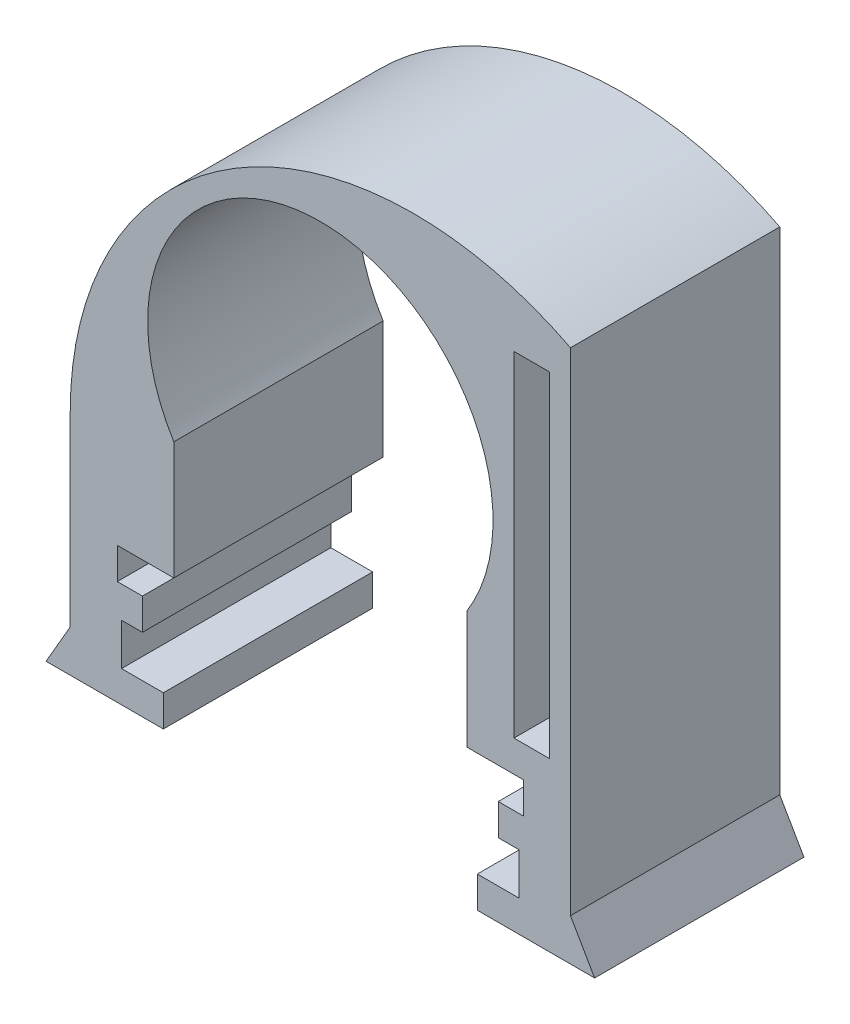
ISO-10303-21;
HEADER;
FILE_DESCRIPTION(('STEP AP214'),'2;1');
FILE_NAME('part.step','',(''),(''),'','','');
FILE_SCHEMA(('AUTOMOTIVE_DESIGN { 1 0 10303 214 1 1 1 1 }'));
ENDSEC;
DATA;
#1=APPLICATION_CONTEXT('core data for automotive mechanical design processes');
#2=APPLICATION_PROTOCOL_DEFINITION('international standard','automotive_design',2000,#1);
#3=PRODUCT_CONTEXT('',#1,'mechanical');
#4=PRODUCT('Part','Part','',(#3));
#5=PRODUCT_RELATED_PRODUCT_CATEGORY('part','',(#4));
#6=PRODUCT_DEFINITION_FORMATION('','',#4);
#7=PRODUCT_DEFINITION_CONTEXT('part definition',#1,'design');
#8=PRODUCT_DEFINITION('design','',#6,#7);
#9=PRODUCT_DEFINITION_SHAPE('','',#8);
#10=(LENGTH_UNIT() NAMED_UNIT(*) SI_UNIT(.MILLI.,.METRE.));
#11=(NAMED_UNIT(*) PLANE_ANGLE_UNIT() SI_UNIT($,.RADIAN.));
#12=(NAMED_UNIT(*) SI_UNIT($,.STERADIAN.) SOLID_ANGLE_UNIT());
#13=UNCERTAINTY_MEASURE_WITH_UNIT(LENGTH_MEASURE(1.E-05),#10,'distance_accuracy_value','');
#14=(GEOMETRIC_REPRESENTATION_CONTEXT(3) GLOBAL_UNCERTAINTY_ASSIGNED_CONTEXT((#13)) GLOBAL_UNIT_ASSIGNED_CONTEXT((#10,
#11,#12)) REPRESENTATION_CONTEXT('',''));
#15=CARTESIAN_POINT('',(0.,0.,0.));
#16=DIRECTION('',(0.,0.,1.));
#17=DIRECTION('',(1.,0.,0.));
#18=AXIS2_PLACEMENT_3D('',#15,#16,#17);
#19=CARTESIAN_POINT('',(11.95,-43.073868480324,10.));
#20=DIRECTION('',(-1.,0.,0.));
#21=DIRECTION('',(0.,0.,1.));
#22=AXIS2_PLACEMENT_3D('',#19,#20,#21);
#23=PLANE('',#22);
#24=DIRECTION('',(0.,1.,0.));
#25=VECTOR('',#24,1.);
#26=CARTESIAN_POINT('',(11.95,-43.073868480324,0.));
#27=LINE('',#26,#25);
#28=CARTESIAN_POINT('',(11.95,-14.5,0.));
#29=VERTEX_POINT('',#28);
#30=CARTESIAN_POINT('',(11.95,9.,0.));
#31=VERTEX_POINT('',#30);
#32=EDGE_CURVE('E277',#29,#31,#27,.T.);
#33=ORIENTED_EDGE('',*,*,#32,.T.);
#34=DIRECTION('',(0.,0.,-1.));
#35=VECTOR('',#34,1.);
#36=CARTESIAN_POINT('',(11.95,9.,10.));
#37=LINE('',#36,#35);
#38=CARTESIAN_POINT('',(11.95,9.,10.));
#39=VERTEX_POINT('',#38);
#40=EDGE_CURVE('E11',#39,#31,#37,.T.);
#41=ORIENTED_EDGE('',*,*,#40,.F.);
#42=DIRECTION('',(0.,1.,0.));
#43=VECTOR('',#42,1.);
#44=CARTESIAN_POINT('',(11.95,-43.073868480324,10.));
#45=LINE('',#44,#43);
#46=CARTESIAN_POINT('',(11.95,-14.5,10.));
#47=VERTEX_POINT('',#46);
#48=EDGE_CURVE('E536',#47,#39,#45,.T.);
#49=ORIENTED_EDGE('',*,*,#48,.F.);
#50=DIRECTION('',(0.,0.,-1.));
#51=VECTOR('',#50,1.);
#52=CARTESIAN_POINT('',(11.95,-14.5,10.));
#53=LINE('',#52,#51);
#54=EDGE_CURVE('E343',#47,#29,#53,.T.);
#55=ORIENTED_EDGE('',*,*,#54,.T.);
#56=EDGE_LOOP('',(#33,#41,#49,#55));
#57=FACE_BOUND('',#56,.T.);
#58=ADVANCED_FACE('F32',(#57),#23,.F.);
#59=CARTESIAN_POINT('',(4.460251975616,-5.6013713203399,10.));
#60=DIRECTION('',(0.,0.,-1.));
#61=DIRECTION('',(-1.,0.,0.));
#62=AXIS2_PLACEMENT_3D('',#59,#60,#61);
#63=CYLINDRICAL_SURFACE('',#62,16.410251975616);
#64=CARTESIAN_POINT('',(4.460251975616,-5.6013713203399,0.));
#65=DIRECTION('',(0.,0.,1.));
#66=DIRECTION('',(1.,0.,0.));
#67=AXIS2_PLACEMENT_3D('',#64,#65,#66);
#68=CIRCLE('',#67,16.410251975616);
#69=CARTESIAN_POINT('',(-11.95,-5.6013713203399,0.));
#70=VERTEX_POINT('',#69);
#71=EDGE_CURVE('E280',#31,#70,#68,.T.);
#72=ORIENTED_EDGE('',*,*,#71,.T.);
#73=DIRECTION('',(0.,0.,-1.));
#74=VECTOR('',#73,1.);
#75=CARTESIAN_POINT('',(-11.95,-5.6013713203399,10.));
#76=LINE('',#75,#74);
#77=CARTESIAN_POINT('',(-11.95,-5.6013713203399,10.));
#78=VERTEX_POINT('',#77);
#79=EDGE_CURVE('E42',#78,#70,#76,.T.);
#80=ORIENTED_EDGE('',*,*,#79,.F.);
#81=CARTESIAN_POINT('',(4.460251975616,-5.6013713203399,10.));
#82=DIRECTION('',(0.,0.,1.));
#83=DIRECTION('',(1.,0.,0.));
#84=AXIS2_PLACEMENT_3D('',#81,#82,#83);
#85=CIRCLE('',#84,16.410251975616);
#86=EDGE_CURVE('E538',#39,#78,#85,.T.);
#87=ORIENTED_EDGE('',*,*,#86,.F.);
#88=ORIENTED_EDGE('',*,*,#40,.T.);
#89=EDGE_LOOP('',(#72,#80,#87,#88));
#90=FACE_BOUND('',#89,.T.);
#91=ADVANCED_FACE('F425',(#90),#63,.T.);
#92=CARTESIAN_POINT('',(-11.95,-43.073868480324,10.));
#93=DIRECTION('',(-1.,0.,0.));
#94=DIRECTION('',(0.,-1.,0.));
#95=AXIS2_PLACEMENT_3D('',#92,#93,#94);
#96=PLANE('',#95);
#97=DIRECTION('',(0.,1.,0.));
#98=VECTOR('',#97,1.);
#99=CARTESIAN_POINT('',(-11.95,-43.073868480324,0.));
#100=LINE('',#99,#98);
#101=CARTESIAN_POINT('',(-11.95,-14.5,0.));
#102=VERTEX_POINT('',#101);
#103=EDGE_CURVE('E283',#102,#70,#100,.T.);
#104=ORIENTED_EDGE('',*,*,#103,.F.);
#105=DIRECTION('',(0.,0.,-1.));
#106=VECTOR('',#105,1.);
#107=CARTESIAN_POINT('',(-11.95,-14.5,10.));
#108=LINE('',#107,#106);
#109=CARTESIAN_POINT('',(-11.95,-14.5,10.));
#110=VERTEX_POINT('',#109);
#111=EDGE_CURVE('E391',#110,#102,#108,.T.);
#112=ORIENTED_EDGE('',*,*,#111,.F.);
#113=DIRECTION('',(0.,1.,0.));
#114=VECTOR('',#113,1.);
#115=CARTESIAN_POINT('',(-11.95,-43.073868480324,10.));
#116=LINE('',#115,#114);
#117=EDGE_CURVE('E540',#110,#78,#116,.T.);
#118=ORIENTED_EDGE('',*,*,#117,.T.);
#119=ORIENTED_EDGE('',*,*,#79,.T.);
#120=EDGE_LOOP('',(#104,#112,#118,#119));
#121=FACE_BOUND('',#120,.T.);
#122=ADVANCED_FACE('F431',(#121),#96,.T.);
#123=CARTESIAN_POINT('',(-20.3410336473567,-29.0336966052417,10.));
#124=DIRECTION('',(-0.866025403784437,0.500000000000004,0.));
#125=DIRECTION('',(-0.500000000000004,-0.866025403784437,0.));
#126=AXIS2_PLACEMENT_3D('',#123,#124,#125);
#127=PLANE('',#126);
#128=DIRECTION('',(0.500000000000004,0.866025403784437,0.));
#129=VECTOR('',#128,1.);
#130=CARTESIAN_POINT('',(-20.3410336473567,-29.0336966052417,0.));
#131=LINE('',#130,#129);
#132=CARTESIAN_POINT('',(-13.1047005383793,-16.5,0.));
#133=VERTEX_POINT('',#132);
#134=EDGE_CURVE('E286',#133,#102,#131,.T.);
#135=ORIENTED_EDGE('',*,*,#134,.F.);
#136=DIRECTION('',(0.,0.,-1.));
#137=VECTOR('',#136,1.);
#138=CARTESIAN_POINT('',(-13.1047005383793,-16.5,10.));
#139=LINE('',#138,#137);
#140=CARTESIAN_POINT('',(-13.1047005383793,-16.5,10.));
#141=VERTEX_POINT('',#140);
#142=EDGE_CURVE('E389',#141,#133,#139,.T.);
#143=ORIENTED_EDGE('',*,*,#142,.F.);
#144=DIRECTION('',(0.500000000000004,0.866025403784437,0.));
#145=VECTOR('',#144,1.);
#146=CARTESIAN_POINT('',(-20.3410336473567,-29.0336966052417,10.));
#147=LINE('',#146,#145);
#148=EDGE_CURVE('E543',#141,#110,#147,.T.);
#149=ORIENTED_EDGE('',*,*,#148,.T.);
#150=ORIENTED_EDGE('',*,*,#111,.T.);
#151=EDGE_LOOP('',(#135,#143,#149,#150));
#152=FACE_BOUND('',#151,.T.);
#153=ADVANCED_FACE('F437',(#152),#127,.T.);
#154=CARTESIAN_POINT('',(3.97725738728515,-16.5,10.));
#155=DIRECTION('',(0.,-1.,0.));
#156=DIRECTION('',(0.,0.,-1.));
#157=AXIS2_PLACEMENT_3D('',#154,#155,#156);
#158=PLANE('',#157);
#159=DIRECTION('',(-1.,0.,0.));
#160=VECTOR('',#159,1.);
#161=CARTESIAN_POINT('',(3.97725738728515,-16.5,0.));
#162=LINE('',#161,#160);
#163=CARTESIAN_POINT('',(-7.5,-16.5,0.));
#164=VERTEX_POINT('',#163);
#165=EDGE_CURVE('E289',#164,#133,#162,.T.);
#166=ORIENTED_EDGE('',*,*,#165,.F.);
#167=DIRECTION('',(0.,0.,-1.));
#168=VECTOR('',#167,1.);
#169=CARTESIAN_POINT('',(-7.5,-16.5,10.));
#170=LINE('',#169,#168);
#171=CARTESIAN_POINT('',(-7.5,-16.5,10.));
#172=VERTEX_POINT('',#171);
#173=EDGE_CURVE('E387',#172,#164,#170,.T.);
#174=ORIENTED_EDGE('',*,*,#173,.F.);
#175=DIRECTION('',(-1.,0.,0.));
#176=VECTOR('',#175,1.);
#177=CARTESIAN_POINT('',(3.97725738728515,-16.5,10.));
#178=LINE('',#177,#176);
#179=EDGE_CURVE('E546',#172,#141,#178,.T.);
#180=ORIENTED_EDGE('',*,*,#179,.T.);
#181=ORIENTED_EDGE('',*,*,#142,.T.);
#182=EDGE_LOOP('',(#166,#174,#180,#181));
#183=FACE_BOUND('',#182,.T.);
#184=ADVANCED_FACE('F441',(#183),#158,.T.);
#185=CARTESIAN_POINT('',(-7.5,-43.073868480324,10.));
#186=DIRECTION('',(1.,0.,0.));
#187=DIRECTION('',(0.,0.,-1.));
#188=AXIS2_PLACEMENT_3D('',#185,#186,#187);
#189=PLANE('',#188);
#190=DIRECTION('',(0.,-1.,0.));
#191=VECTOR('',#190,1.);
#192=CARTESIAN_POINT('',(-7.5,-43.073868480324,0.));
#193=LINE('',#192,#191);
#194=CARTESIAN_POINT('',(-7.5,-15.,0.));
#195=VERTEX_POINT('',#194);
#196=EDGE_CURVE('E292',#195,#164,#193,.T.);
#197=ORIENTED_EDGE('',*,*,#196,.F.);
#198=DIRECTION('',(0.,0.,-1.));
#199=VECTOR('',#198,1.);
#200=CARTESIAN_POINT('',(-7.5,-15.,10.));
#201=LINE('',#200,#199);
#202=CARTESIAN_POINT('',(-7.5,-15.,10.));
#203=VERTEX_POINT('',#202);
#204=EDGE_CURVE('E385',#203,#195,#201,.T.);
#205=ORIENTED_EDGE('',*,*,#204,.F.);
#206=DIRECTION('',(0.,-1.,0.));
#207=VECTOR('',#206,1.);
#208=CARTESIAN_POINT('',(-7.5,-43.073868480324,10.));
#209=LINE('',#208,#207);
#210=EDGE_CURVE('E549',#203,#172,#209,.T.);
#211=ORIENTED_EDGE('',*,*,#210,.T.);
#212=ORIENTED_EDGE('',*,*,#173,.T.);
#213=EDGE_LOOP('',(#197,#205,#211,#212));
#214=FACE_BOUND('',#213,.T.);
#215=ADVANCED_FACE('F445',(#214),#189,.T.);
#216=CARTESIAN_POINT('',(3.97725738728515,-15.,10.));
#217=DIRECTION('',(0.,1.,0.));
#218=DIRECTION('',(0.,0.,1.));
#219=AXIS2_PLACEMENT_3D('',#216,#217,#218);
#220=PLANE('',#219);
#221=DIRECTION('',(1.,0.,0.));
#222=VECTOR('',#221,1.);
#223=CARTESIAN_POINT('',(3.97725738728515,-15.,0.));
#224=LINE('',#223,#222);
#225=CARTESIAN_POINT('',(-9.5,-15.,0.));
#226=VERTEX_POINT('',#225);
#227=EDGE_CURVE('E295',#226,#195,#224,.T.);
#228=ORIENTED_EDGE('',*,*,#227,.F.);
#229=DIRECTION('',(0.,0.,-1.));
#230=VECTOR('',#229,1.);
#231=CARTESIAN_POINT('',(-9.5,-15.,10.));
#232=LINE('',#231,#230);
#233=CARTESIAN_POINT('',(-9.5,-15.,10.));
#234=VERTEX_POINT('',#233);
#235=EDGE_CURVE('E383',#234,#226,#232,.T.);
#236=ORIENTED_EDGE('',*,*,#235,.F.);
#237=DIRECTION('',(1.,0.,0.));
#238=VECTOR('',#237,1.);
#239=CARTESIAN_POINT('',(3.97725738728515,-15.,10.));
#240=LINE('',#239,#238);
#241=EDGE_CURVE('E552',#234,#203,#240,.T.);
#242=ORIENTED_EDGE('',*,*,#241,.T.);
#243=ORIENTED_EDGE('',*,*,#204,.T.);
#244=EDGE_LOOP('',(#228,#236,#242,#243));
#245=FACE_BOUND('',#244,.T.);
#246=ADVANCED_FACE('F449',(#245),#220,.T.);
#247=CARTESIAN_POINT('',(-9.5,-43.073868480324,10.));
#248=DIRECTION('',(1.,0.,0.));
#249=DIRECTION('',(0.,0.,-1.));
#250=AXIS2_PLACEMENT_3D('',#247,#248,#249);
#251=PLANE('',#250);
#252=DIRECTION('',(0.,-1.,0.));
#253=VECTOR('',#252,1.);
#254=CARTESIAN_POINT('',(-9.5,-43.073868480324,0.));
#255=LINE('',#254,#253);
#256=CARTESIAN_POINT('',(-9.5,-13.,0.));
#257=VERTEX_POINT('',#256);
#258=EDGE_CURVE('E298',#257,#226,#255,.T.);
#259=ORIENTED_EDGE('',*,*,#258,.F.);
#260=DIRECTION('',(0.,0.,-1.));
#261=VECTOR('',#260,1.);
#262=CARTESIAN_POINT('',(-9.5,-13.,10.));
#263=LINE('',#262,#261);
#264=CARTESIAN_POINT('',(-9.5,-13.,10.));
#265=VERTEX_POINT('',#264);
#266=EDGE_CURVE('E381',#265,#257,#263,.T.);
#267=ORIENTED_EDGE('',*,*,#266,.F.);
#268=DIRECTION('',(0.,-1.,0.));
#269=VECTOR('',#268,1.);
#270=CARTESIAN_POINT('',(-9.5,-43.073868480324,10.));
#271=LINE('',#270,#269);
#272=EDGE_CURVE('E555',#265,#234,#271,.T.);
#273=ORIENTED_EDGE('',*,*,#272,.T.);
#274=ORIENTED_EDGE('',*,*,#235,.T.);
#275=EDGE_LOOP('',(#259,#267,#273,#274));
#276=FACE_BOUND('',#275,.T.);
#277=ADVANCED_FACE('F453',(#276),#251,.T.);
#278=CARTESIAN_POINT('',(3.97725738728515,-13.,10.));
#279=DIRECTION('',(0.,-1.,0.));
#280=DIRECTION('',(0.,0.,-1.));
#281=AXIS2_PLACEMENT_3D('',#278,#279,#280);
#282=PLANE('',#281);
#283=DIRECTION('',(-1.,0.,0.));
#284=VECTOR('',#283,1.);
#285=CARTESIAN_POINT('',(3.97725738728515,-13.,0.));
#286=LINE('',#285,#284);
#287=CARTESIAN_POINT('',(-8.5,-13.,0.));
#288=VERTEX_POINT('',#287);
#289=EDGE_CURVE('E301',#288,#257,#286,.T.);
#290=ORIENTED_EDGE('',*,*,#289,.F.);
#291=DIRECTION('',(0.,0.,-1.));
#292=VECTOR('',#291,1.);
#293=CARTESIAN_POINT('',(-8.5,-13.,10.));
#294=LINE('',#293,#292);
#295=CARTESIAN_POINT('',(-8.5,-13.,10.));
#296=VERTEX_POINT('',#295);
#297=EDGE_CURVE('E379',#296,#288,#294,.T.);
#298=ORIENTED_EDGE('',*,*,#297,.F.);
#299=DIRECTION('',(-1.,0.,0.));
#300=VECTOR('',#299,1.);
#301=CARTESIAN_POINT('',(3.97725738728515,-13.,10.));
#302=LINE('',#301,#300);
#303=EDGE_CURVE('E558',#296,#265,#302,.T.);
#304=ORIENTED_EDGE('',*,*,#303,.T.);
#305=ORIENTED_EDGE('',*,*,#266,.T.);
#306=EDGE_LOOP('',(#290,#298,#304,#305));
#307=FACE_BOUND('',#306,.T.);
#308=ADVANCED_FACE('F457',(#307),#282,.T.);
#309=CARTESIAN_POINT('',(-8.5,-43.073868480324,10.));
#310=DIRECTION('',(-1.,0.,0.));
#311=DIRECTION('',(0.,0.,1.));
#312=AXIS2_PLACEMENT_3D('',#309,#310,#311);
#313=PLANE('',#312);
#314=DIRECTION('',(0.,1.,0.));
#315=VECTOR('',#314,1.);
#316=CARTESIAN_POINT('',(-8.5,-43.073868480324,0.));
#317=LINE('',#316,#315);
#318=CARTESIAN_POINT('',(-8.5,-11.5,0.));
#319=VERTEX_POINT('',#318);
#320=EDGE_CURVE('E304',#288,#319,#317,.T.);
#321=ORIENTED_EDGE('',*,*,#320,.T.);
#322=DIRECTION('',(0.,0.,-1.));
#323=VECTOR('',#322,1.);
#324=CARTESIAN_POINT('',(-8.5,-11.5,10.));
#325=LINE('',#324,#323);
#326=CARTESIAN_POINT('',(-8.5,-11.5,10.));
#327=VERTEX_POINT('',#326);
#328=EDGE_CURVE('E376',#327,#319,#325,.T.);
#329=ORIENTED_EDGE('',*,*,#328,.F.);
#330=DIRECTION('',(0.,1.,0.));
#331=VECTOR('',#330,1.);
#332=CARTESIAN_POINT('',(-8.5,-43.073868480324,10.));
#333=LINE('',#332,#331);
#334=EDGE_CURVE('E561',#296,#327,#333,.T.);
#335=ORIENTED_EDGE('',*,*,#334,.F.);
#336=ORIENTED_EDGE('',*,*,#297,.T.);
#337=EDGE_LOOP('',(#321,#329,#335,#336));
#338=FACE_BOUND('',#337,.T.);
#339=ADVANCED_FACE('F461',(#338),#313,.F.);
#340=CARTESIAN_POINT('',(3.97725738728511,-11.5,10.));
#341=DIRECTION('',(0.,-1.,0.));
#342=DIRECTION('',(1.,0.,0.));
#343=AXIS2_PLACEMENT_3D('',#340,#341,#342);
#344=PLANE('',#343);
#345=DIRECTION('',(-1.,0.,0.));
#346=VECTOR('',#345,1.);
#347=CARTESIAN_POINT('',(3.97725738728511,-11.5,0.));
#348=LINE('',#347,#346);
#349=CARTESIAN_POINT('',(-9.7,-11.5,0.));
#350=VERTEX_POINT('',#349);
#351=EDGE_CURVE('E306',#319,#350,#348,.T.);
#352=ORIENTED_EDGE('',*,*,#351,.T.);
#353=DIRECTION('',(0.,0.,-1.));
#354=VECTOR('',#353,1.);
#355=CARTESIAN_POINT('',(-9.7,-11.5,10.));
#356=LINE('',#355,#354);
#357=CARTESIAN_POINT('',(-9.7,-11.5,10.));
#358=VERTEX_POINT('',#357);
#359=EDGE_CURVE('E373',#358,#350,#356,.T.);
#360=ORIENTED_EDGE('',*,*,#359,.F.);
#361=DIRECTION('',(-1.,0.,0.));
#362=VECTOR('',#361,1.);
#363=CARTESIAN_POINT('',(3.97725738728511,-11.5,10.));
#364=LINE('',#363,#362);
#365=EDGE_CURVE('E563',#327,#358,#364,.T.);
#366=ORIENTED_EDGE('',*,*,#365,.F.);
#367=ORIENTED_EDGE('',*,*,#328,.T.);
#368=EDGE_LOOP('',(#352,#360,#366,#367));
#369=FACE_BOUND('',#368,.T.);
#370=ADVANCED_FACE('F465',(#369),#344,.F.);
#371=CARTESIAN_POINT('',(-9.70000000000003,-43.073868480324,10.));
#372=DIRECTION('',(-1.,0.,0.));
#373=DIRECTION('',(0.,-1.,0.));
#374=AXIS2_PLACEMENT_3D('',#371,#372,#373);
#375=PLANE('',#374);
#376=DIRECTION('',(0.,1.,0.));
#377=VECTOR('',#376,1.);
#378=CARTESIAN_POINT('',(-9.70000000000003,-43.073868480324,0.));
#379=LINE('',#378,#377);
#380=CARTESIAN_POINT('',(-9.7,-10.,0.));
#381=VERTEX_POINT('',#380);
#382=EDGE_CURVE('E308',#350,#381,#379,.T.);
#383=ORIENTED_EDGE('',*,*,#382,.T.);
#384=DIRECTION('',(0.,0.,-1.));
#385=VECTOR('',#384,1.);
#386=CARTESIAN_POINT('',(-9.7,-10.,10.));
#387=LINE('',#386,#385);
#388=CARTESIAN_POINT('',(-9.7,-10.,10.));
#389=VERTEX_POINT('',#388);
#390=EDGE_CURVE('E370',#389,#381,#387,.T.);
#391=ORIENTED_EDGE('',*,*,#390,.F.);
#392=DIRECTION('',(0.,1.,0.));
#393=VECTOR('',#392,1.);
#394=CARTESIAN_POINT('',(-9.70000000000003,-43.073868480324,10.));
#395=LINE('',#394,#393);
#396=EDGE_CURVE('E565',#358,#389,#395,.T.);
#397=ORIENTED_EDGE('',*,*,#396,.F.);
#398=ORIENTED_EDGE('',*,*,#359,.T.);
#399=EDGE_LOOP('',(#383,#391,#397,#398));
#400=FACE_BOUND('',#399,.T.);
#401=ADVANCED_FACE('F469',(#400),#375,.F.);
#402=CARTESIAN_POINT('',(3.97725738728513,-9.99999999999999,10.));
#403=DIRECTION('',(0.,1.,0.));
#404=DIRECTION('',(-1.,0.,0.));
#405=AXIS2_PLACEMENT_3D('',#402,#403,#404);
#406=PLANE('',#405);
#407=DIRECTION('',(1.,0.,0.));
#408=VECTOR('',#407,1.);
#409=CARTESIAN_POINT('',(3.97725738728513,-9.99999999999999,0.));
#410=LINE('',#409,#408);
#411=CARTESIAN_POINT('',(-7.,-10.,0.));
#412=VERTEX_POINT('',#411);
#413=EDGE_CURVE('E310',#381,#412,#410,.T.);
#414=ORIENTED_EDGE('',*,*,#413,.T.);
#415=DIRECTION('',(0.,0.,-1.));
#416=VECTOR('',#415,1.);
#417=CARTESIAN_POINT('',(-7.,-10.,10.));
#418=LINE('',#417,#416);
#419=CARTESIAN_POINT('',(-7.,-10.,10.));
#420=VERTEX_POINT('',#419);
#421=EDGE_CURVE('E367',#420,#412,#418,.T.);
#422=ORIENTED_EDGE('',*,*,#421,.F.);
#423=DIRECTION('',(1.,0.,0.));
#424=VECTOR('',#423,1.);
#425=CARTESIAN_POINT('',(3.97725738728513,-9.99999999999999,10.));
#426=LINE('',#425,#424);
#427=EDGE_CURVE('E567',#389,#420,#426,.T.);
#428=ORIENTED_EDGE('',*,*,#427,.F.);
#429=ORIENTED_EDGE('',*,*,#390,.T.);
#430=EDGE_LOOP('',(#414,#422,#428,#429));
#431=FACE_BOUND('',#430,.T.);
#432=ADVANCED_FACE('F473',(#431),#406,.F.);
#433=CARTESIAN_POINT('',(-7.,-43.073868480324,10.));
#434=DIRECTION('',(-1.,0.,0.));
#435=DIRECTION('',(0.,0.,1.));
#436=AXIS2_PLACEMENT_3D('',#433,#434,#435);
#437=PLANE('',#436);
#438=DIRECTION('',(0.,1.,0.));
#439=VECTOR('',#438,1.);
#440=CARTESIAN_POINT('',(-7.,-43.073868480324,0.));
#441=LINE('',#440,#439);
#442=CARTESIAN_POINT('',(-7.,-4.36606229914324,0.));
#443=VERTEX_POINT('',#442);
#444=EDGE_CURVE('E312',#412,#443,#441,.T.);
#445=ORIENTED_EDGE('',*,*,#444,.T.);
#446=DIRECTION('',(0.,0.,-1.));
#447=VECTOR('',#446,1.);
#448=CARTESIAN_POINT('',(-7.,-4.36606229914324,10.));
#449=LINE('',#448,#447);
#450=CARTESIAN_POINT('',(-7.,-4.36606229914324,10.));
#451=VERTEX_POINT('',#450);
#452=EDGE_CURVE('E365',#451,#443,#449,.T.);
#453=ORIENTED_EDGE('',*,*,#452,.F.);
#454=DIRECTION('',(0.,1.,0.));
#455=VECTOR('',#454,1.);
#456=CARTESIAN_POINT('',(-7.,-43.073868480324,10.));
#457=LINE('',#456,#455);
#458=EDGE_CURVE('E569',#420,#451,#457,.T.);
#459=ORIENTED_EDGE('',*,*,#458,.F.);
#460=ORIENTED_EDGE('',*,*,#421,.T.);
#461=EDGE_LOOP('',(#445,#453,#459,#460));
#462=FACE_BOUND('',#461,.T.);
#463=ADVANCED_FACE('F477',(#462),#437,.F.);
#464=CARTESIAN_POINT('',(0.,0.,10.));
#465=DIRECTION('',(0.,0.,-1.));
#466=DIRECTION('',(-1.,0.,0.));
#467=AXIS2_PLACEMENT_3D('',#464,#465,#466);
#468=CYLINDRICAL_SURFACE('',#467,8.25);
#469=CARTESIAN_POINT('',(0.,0.,0.));
#470=DIRECTION('',(0.,0.,1.));
#471=DIRECTION('',(1.,0.,0.));
#472=AXIS2_PLACEMENT_3D('',#469,#470,#471);
#473=CIRCLE('',#472,8.25);
#474=CARTESIAN_POINT('',(7.,-4.36606229914324,0.));
#475=VERTEX_POINT('',#474);
#476=EDGE_CURVE('E315',#475,#443,#473,.T.);
#477=ORIENTED_EDGE('',*,*,#476,.F.);
#478=DIRECTION('',(0.,0.,-1.));
#479=VECTOR('',#478,1.);
#480=CARTESIAN_POINT('',(7.,-4.36606229914324,10.));
#481=LINE('',#480,#479);
#482=CARTESIAN_POINT('',(7.,-4.36606229914324,10.));
#483=VERTEX_POINT('',#482);
#484=EDGE_CURVE('E363',#483,#475,#481,.T.);
#485=ORIENTED_EDGE('',*,*,#484,.F.);
#486=CARTESIAN_POINT('',(0.,0.,10.));
#487=DIRECTION('',(0.,0.,1.));
#488=DIRECTION('',(1.,0.,0.));
#489=AXIS2_PLACEMENT_3D('',#486,#487,#488);
#490=CIRCLE('',#489,8.25);
#491=EDGE_CURVE('E571',#483,#451,#490,.T.);
#492=ORIENTED_EDGE('',*,*,#491,.T.);
#493=ORIENTED_EDGE('',*,*,#452,.T.);
#494=EDGE_LOOP('',(#477,#485,#492,#493));
#495=FACE_BOUND('',#494,.T.);
#496=ADVANCED_FACE('F481',(#495),#468,.F.);
#497=CARTESIAN_POINT('',(7.,-43.073868480324,10.));
#498=DIRECTION('',(-1.,0.,0.));
#499=DIRECTION('',(0.,0.,1.));
#500=AXIS2_PLACEMENT_3D('',#497,#498,#499);
#501=PLANE('',#500);
#502=DIRECTION('',(0.,1.,0.));
#503=VECTOR('',#502,1.);
#504=CARTESIAN_POINT('',(7.,-43.073868480324,0.));
#505=LINE('',#504,#503);
#506=CARTESIAN_POINT('',(7.,-10.,0.));
#507=VERTEX_POINT('',#506);
#508=EDGE_CURVE('E318',#507,#475,#505,.T.);
#509=ORIENTED_EDGE('',*,*,#508,.F.);
#510=DIRECTION('',(0.,0.,-1.));
#511=VECTOR('',#510,1.);
#512=CARTESIAN_POINT('',(7.,-10.,10.));
#513=LINE('',#512,#511);
#514=CARTESIAN_POINT('',(7.,-10.,10.));
#515=VERTEX_POINT('',#514);
#516=EDGE_CURVE('E361',#515,#507,#513,.T.);
#517=ORIENTED_EDGE('',*,*,#516,.F.);
#518=DIRECTION('',(0.,1.,0.));
#519=VECTOR('',#518,1.);
#520=CARTESIAN_POINT('',(7.,-43.073868480324,10.));
#521=LINE('',#520,#519);
#522=EDGE_CURVE('E574',#515,#483,#521,.T.);
#523=ORIENTED_EDGE('',*,*,#522,.T.);
#524=ORIENTED_EDGE('',*,*,#484,.T.);
#525=EDGE_LOOP('',(#509,#517,#523,#524));
#526=FACE_BOUND('',#525,.T.);
#527=ADVANCED_FACE('F485',(#526),#501,.T.);
#528=CARTESIAN_POINT('',(3.97725738728515,-10.,10.));
#529=DIRECTION('',(0.,-1.,0.));
#530=DIRECTION('',(0.,0.,-1.));
#531=AXIS2_PLACEMENT_3D('',#528,#529,#530);
#532=PLANE('',#531);
#533=DIRECTION('',(-1.,0.,0.));
#534=VECTOR('',#533,1.);
#535=CARTESIAN_POINT('',(3.97725738728515,-10.,0.));
#536=LINE('',#535,#534);
#537=CARTESIAN_POINT('',(9.7,-10.,0.));
#538=VERTEX_POINT('',#537);
#539=EDGE_CURVE('E321',#538,#507,#536,.T.);
#540=ORIENTED_EDGE('',*,*,#539,.F.);
#541=DIRECTION('',(0.,0.,-1.));
#542=VECTOR('',#541,1.);
#543=CARTESIAN_POINT('',(9.7,-10.,10.));
#544=LINE('',#543,#542);
#545=CARTESIAN_POINT('',(9.7,-10.,10.));
#546=VERTEX_POINT('',#545);
#547=EDGE_CURVE('E359',#546,#538,#544,.T.);
#548=ORIENTED_EDGE('',*,*,#547,.F.);
#549=DIRECTION('',(-1.,0.,0.));
#550=VECTOR('',#549,1.);
#551=CARTESIAN_POINT('',(3.97725738728515,-10.,10.));
#552=LINE('',#551,#550);
#553=EDGE_CURVE('E577',#546,#515,#552,.T.);
#554=ORIENTED_EDGE('',*,*,#553,.T.);
#555=ORIENTED_EDGE('',*,*,#516,.T.);
#556=EDGE_LOOP('',(#540,#548,#554,#555));
#557=FACE_BOUND('',#556,.T.);
#558=ADVANCED_FACE('F489',(#557),#532,.T.);
#559=CARTESIAN_POINT('',(9.70000000000004,-43.073868480324,10.));
#560=DIRECTION('',(-1.,0.,0.));
#561=DIRECTION('',(0.,-1.,0.));
#562=AXIS2_PLACEMENT_3D('',#559,#560,#561);
#563=PLANE('',#562);
#564=DIRECTION('',(0.,1.,0.));
#565=VECTOR('',#564,1.);
#566=CARTESIAN_POINT('',(9.70000000000004,-43.073868480324,0.));
#567=LINE('',#566,#565);
#568=CARTESIAN_POINT('',(9.7,-11.5,0.));
#569=VERTEX_POINT('',#568);
#570=EDGE_CURVE('E324',#569,#538,#567,.T.);
#571=ORIENTED_EDGE('',*,*,#570,.F.);
#572=DIRECTION('',(0.,0.,-1.));
#573=VECTOR('',#572,1.);
#574=CARTESIAN_POINT('',(9.7,-11.5,10.));
#575=LINE('',#574,#573);
#576=CARTESIAN_POINT('',(9.7,-11.5,10.));
#577=VERTEX_POINT('',#576);
#578=EDGE_CURVE('E357',#577,#569,#575,.T.);
#579=ORIENTED_EDGE('',*,*,#578,.F.);
#580=DIRECTION('',(0.,1.,0.));
#581=VECTOR('',#580,1.);
#582=CARTESIAN_POINT('',(9.70000000000004,-43.073868480324,10.));
#583=LINE('',#582,#581);
#584=EDGE_CURVE('E580',#577,#546,#583,.T.);
#585=ORIENTED_EDGE('',*,*,#584,.T.);
#586=ORIENTED_EDGE('',*,*,#547,.T.);
#587=EDGE_LOOP('',(#571,#579,#585,#586));
#588=FACE_BOUND('',#587,.T.);
#589=ADVANCED_FACE('F493',(#588),#563,.T.);
#590=CARTESIAN_POINT('',(3.97725738728515,-11.5,10.));
#591=DIRECTION('',(0.,1.,0.));
#592=DIRECTION('',(0.,0.,1.));
#593=AXIS2_PLACEMENT_3D('',#590,#591,#592);
#594=PLANE('',#593);
#595=DIRECTION('',(1.,0.,0.));
#596=VECTOR('',#595,1.);
#597=CARTESIAN_POINT('',(3.97725738728515,-11.5,0.));
#598=LINE('',#597,#596);
#599=CARTESIAN_POINT('',(8.5,-11.5,0.));
#600=VERTEX_POINT('',#599);
#601=EDGE_CURVE('E327',#600,#569,#598,.T.);
#602=ORIENTED_EDGE('',*,*,#601,.F.);
#603=DIRECTION('',(0.,0.,-1.));
#604=VECTOR('',#603,1.);
#605=CARTESIAN_POINT('',(8.5,-11.5,10.));
#606=LINE('',#605,#604);
#607=CARTESIAN_POINT('',(8.5,-11.5,10.));
#608=VERTEX_POINT('',#607);
#609=EDGE_CURVE('E355',#608,#600,#606,.T.);
#610=ORIENTED_EDGE('',*,*,#609,.F.);
#611=DIRECTION('',(1.,0.,0.));
#612=VECTOR('',#611,1.);
#613=CARTESIAN_POINT('',(3.97725738728515,-11.5,10.));
#614=LINE('',#613,#612);
#615=EDGE_CURVE('E583',#608,#577,#614,.T.);
#616=ORIENTED_EDGE('',*,*,#615,.T.);
#617=ORIENTED_EDGE('',*,*,#578,.T.);
#618=EDGE_LOOP('',(#602,#610,#616,#617));
#619=FACE_BOUND('',#618,.T.);
#620=ADVANCED_FACE('F497',(#619),#594,.T.);
#621=CARTESIAN_POINT('',(8.5,-43.073868480324,10.));
#622=DIRECTION('',(-1.,0.,0.));
#623=DIRECTION('',(0.,0.,1.));
#624=AXIS2_PLACEMENT_3D('',#621,#622,#623);
#625=PLANE('',#624);
#626=DIRECTION('',(0.,1.,0.));
#627=VECTOR('',#626,1.);
#628=CARTESIAN_POINT('',(8.5,-43.073868480324,0.));
#629=LINE('',#628,#627);
#630=CARTESIAN_POINT('',(8.5,-13.,0.));
#631=VERTEX_POINT('',#630);
#632=EDGE_CURVE('E330',#631,#600,#629,.T.);
#633=ORIENTED_EDGE('',*,*,#632,.F.);
#634=DIRECTION('',(0.,0.,-1.));
#635=VECTOR('',#634,1.);
#636=CARTESIAN_POINT('',(8.5,-13.,10.));
#637=LINE('',#636,#635);
#638=CARTESIAN_POINT('',(8.5,-13.,10.));
#639=VERTEX_POINT('',#638);
#640=EDGE_CURVE('E353',#639,#631,#637,.T.);
#641=ORIENTED_EDGE('',*,*,#640,.F.);
#642=DIRECTION('',(0.,1.,0.));
#643=VECTOR('',#642,1.);
#644=CARTESIAN_POINT('',(8.5,-43.073868480324,10.));
#645=LINE('',#644,#643);
#646=EDGE_CURVE('E586',#639,#608,#645,.T.);
#647=ORIENTED_EDGE('',*,*,#646,.T.);
#648=ORIENTED_EDGE('',*,*,#609,.T.);
#649=EDGE_LOOP('',(#633,#641,#647,#648));
#650=FACE_BOUND('',#649,.T.);
#651=ADVANCED_FACE('F501',(#650),#625,.T.);
#652=CARTESIAN_POINT('',(3.97725738728515,-13.,10.));
#653=DIRECTION('',(0.,1.,0.));
#654=DIRECTION('',(0.,0.,1.));
#655=AXIS2_PLACEMENT_3D('',#652,#653,#654);
#656=PLANE('',#655);
#657=DIRECTION('',(1.,0.,0.));
#658=VECTOR('',#657,1.);
#659=CARTESIAN_POINT('',(3.97725738728515,-13.,0.));
#660=LINE('',#659,#658);
#661=CARTESIAN_POINT('',(9.5,-13.,0.));
#662=VERTEX_POINT('',#661);
#663=EDGE_CURVE('E333',#631,#662,#660,.T.);
#664=ORIENTED_EDGE('',*,*,#663,.T.);
#665=DIRECTION('',(0.,0.,-1.));
#666=VECTOR('',#665,1.);
#667=CARTESIAN_POINT('',(9.5,-13.,10.));
#668=LINE('',#667,#666);
#669=CARTESIAN_POINT('',(9.5,-13.,10.));
#670=VERTEX_POINT('',#669);
#671=EDGE_CURVE('E350',#670,#662,#668,.T.);
#672=ORIENTED_EDGE('',*,*,#671,.F.);
#673=DIRECTION('',(1.,0.,0.));
#674=VECTOR('',#673,1.);
#675=CARTESIAN_POINT('',(3.97725738728515,-13.,10.));
#676=LINE('',#675,#674);
#677=EDGE_CURVE('E589',#639,#670,#676,.T.);
#678=ORIENTED_EDGE('',*,*,#677,.F.);
#679=ORIENTED_EDGE('',*,*,#640,.T.);
#680=EDGE_LOOP('',(#664,#672,#678,#679));
#681=FACE_BOUND('',#680,.T.);
#682=ADVANCED_FACE('F505',(#681),#656,.F.);
#683=CARTESIAN_POINT('',(9.5,-43.073868480324,10.));
#684=DIRECTION('',(1.,0.,0.));
#685=DIRECTION('',(0.,0.,-1.));
#686=AXIS2_PLACEMENT_3D('',#683,#684,#685);
#687=PLANE('',#686);
#688=DIRECTION('',(0.,-1.,0.));
#689=VECTOR('',#688,1.);
#690=CARTESIAN_POINT('',(9.5,-43.073868480324,0.));
#691=LINE('',#690,#689);
#692=CARTESIAN_POINT('',(9.5,-15.,0.));
#693=VERTEX_POINT('',#692);
#694=EDGE_CURVE('E335',#662,#693,#691,.T.);
#695=ORIENTED_EDGE('',*,*,#694,.T.);
#696=DIRECTION('',(0.,0.,-1.));
#697=VECTOR('',#696,1.);
#698=CARTESIAN_POINT('',(9.5,-15.,10.));
#699=LINE('',#698,#697);
#700=CARTESIAN_POINT('',(9.5,-15.,10.));
#701=VERTEX_POINT('',#700);
#702=EDGE_CURVE('E347',#701,#693,#699,.T.);
#703=ORIENTED_EDGE('',*,*,#702,.F.);
#704=DIRECTION('',(0.,-1.,0.));
#705=VECTOR('',#704,1.);
#706=CARTESIAN_POINT('',(9.5,-43.073868480324,10.));
#707=LINE('',#706,#705);
#708=EDGE_CURVE('E591',#670,#701,#707,.T.);
#709=ORIENTED_EDGE('',*,*,#708,.F.);
#710=ORIENTED_EDGE('',*,*,#671,.T.);
#711=EDGE_LOOP('',(#695,#703,#709,#710));
#712=FACE_BOUND('',#711,.T.);
#713=ADVANCED_FACE('F509',(#712),#687,.F.);
#714=CARTESIAN_POINT('',(3.97725738728515,-15.,10.));
#715=DIRECTION('',(0.,-1.,0.));
#716=DIRECTION('',(0.,0.,-1.));
#717=AXIS2_PLACEMENT_3D('',#714,#715,#716);
#718=PLANE('',#717);
#719=DIRECTION('',(-1.,0.,0.));
#720=VECTOR('',#719,1.);
#721=CARTESIAN_POINT('',(3.97725738728515,-15.,0.));
#722=LINE('',#721,#720);
#723=CARTESIAN_POINT('',(7.5,-15.,0.));
#724=VERTEX_POINT('',#723);
#725=EDGE_CURVE('E337',#693,#724,#722,.T.);
#726=ORIENTED_EDGE('',*,*,#725,.T.);
#727=DIRECTION('',(0.,0.,-1.));
#728=VECTOR('',#727,1.);
#729=CARTESIAN_POINT('',(7.5,-15.,10.));
#730=LINE('',#729,#728);
#731=CARTESIAN_POINT('',(7.5,-15.,10.));
#732=VERTEX_POINT('',#731);
#733=EDGE_CURVE('E256',#732,#724,#730,.T.);
#734=ORIENTED_EDGE('',*,*,#733,.F.);
#735=DIRECTION('',(-1.,0.,0.));
#736=VECTOR('',#735,1.);
#737=CARTESIAN_POINT('',(3.97725738728515,-15.,10.));
#738=LINE('',#737,#736);
#739=EDGE_CURVE('E247',#701,#732,#738,.T.);
#740=ORIENTED_EDGE('',*,*,#739,.F.);
#741=ORIENTED_EDGE('',*,*,#702,.T.);
#742=EDGE_LOOP('',(#726,#734,#740,#741));
#743=FACE_BOUND('',#742,.T.);
#744=ADVANCED_FACE('F513',(#743),#718,.F.);
#745=CARTESIAN_POINT('',(7.5,-43.073868480324,10.));
#746=DIRECTION('',(1.,0.,0.));
#747=DIRECTION('',(0.,0.,-1.));
#748=AXIS2_PLACEMENT_3D('',#745,#746,#747);
#749=PLANE('',#748);
#750=DIRECTION('',(0.,-1.,0.));
#751=VECTOR('',#750,1.);
#752=CARTESIAN_POINT('',(7.5,-43.073868480324,0.));
#753=LINE('',#752,#751);
#754=CARTESIAN_POINT('',(7.5,-16.5,0.));
#755=VERTEX_POINT('',#754);
#756=EDGE_CURVE('E255',#724,#755,#753,.T.);
#757=ORIENTED_EDGE('',*,*,#756,.T.);
#758=DIRECTION('',(0.,0.,-1.));
#759=VECTOR('',#758,1.);
#760=CARTESIAN_POINT('',(7.5,-16.5,10.));
#761=LINE('',#760,#759);
#762=CARTESIAN_POINT('',(7.5,-16.5,10.));
#763=VERTEX_POINT('',#762);
#764=EDGE_CURVE('E252',#763,#755,#761,.T.);
#765=ORIENTED_EDGE('',*,*,#764,.F.);
#766=DIRECTION('',(0.,-1.,0.));
#767=VECTOR('',#766,1.);
#768=CARTESIAN_POINT('',(7.5,-43.073868480324,10.));
#769=LINE('',#768,#767);
#770=EDGE_CURVE('E241',#732,#763,#769,.T.);
#771=ORIENTED_EDGE('',*,*,#770,.F.);
#772=ORIENTED_EDGE('',*,*,#733,.T.);
#773=EDGE_LOOP('',(#757,#765,#771,#772));
#774=FACE_BOUND('',#773,.T.);
#775=ADVANCED_FACE('F253',(#774),#749,.F.);
#776=CARTESIAN_POINT('',(3.97725738728515,-16.5,10.));
#777=DIRECTION('',(0.,1.,0.));
#778=DIRECTION('',(0.,0.,1.));
#779=AXIS2_PLACEMENT_3D('',#776,#777,#778);
#780=PLANE('',#779);
#781=DIRECTION('',(1.,0.,0.));
#782=VECTOR('',#781,1.);
#783=CARTESIAN_POINT('',(3.97725738728515,-16.5,0.));
#784=LINE('',#783,#782);
#785=CARTESIAN_POINT('',(13.1047005383793,-16.5,0.));
#786=VERTEX_POINT('',#785);
#787=EDGE_CURVE('E146',#755,#786,#784,.T.);
#788=ORIENTED_EDGE('',*,*,#787,.T.);
#789=DIRECTION('',(0.,0.,-1.));
#790=VECTOR('',#789,1.);
#791=CARTESIAN_POINT('',(13.1047005383793,-16.5,10.));
#792=LINE('',#791,#790);
#793=CARTESIAN_POINT('',(13.1047005383793,-16.5,10.));
#794=VERTEX_POINT('',#793);
#795=EDGE_CURVE('E257',#794,#786,#792,.T.);
#796=ORIENTED_EDGE('',*,*,#795,.F.);
#797=DIRECTION('',(1.,0.,0.));
#798=VECTOR('',#797,1.);
#799=CARTESIAN_POINT('',(3.97725738728515,-16.5,10.));
#800=LINE('',#799,#798);
#801=EDGE_CURVE('E245',#763,#794,#800,.T.);
#802=ORIENTED_EDGE('',*,*,#801,.F.);
#803=ORIENTED_EDGE('',*,*,#764,.T.);
#804=EDGE_LOOP('',(#788,#796,#802,#803));
#805=FACE_BOUND('',#804,.T.);
#806=ADVANCED_FACE('F259',(#805),#780,.F.);
#807=CARTESIAN_POINT('',(3.97725738728515,7.50000000000001,10.));
#808=DIRECTION('',(0.,1.,0.));
#809=DIRECTION('',(0.,0.,1.));
#810=AXIS2_PLACEMENT_3D('',#807,#808,#809);
#811=PLANE('',#810);
#812=DIRECTION('',(1.,0.,0.));
#813=VECTOR('',#812,1.);
#814=CARTESIAN_POINT('',(3.97725738728515,7.50000000000001,0.));
#815=LINE('',#814,#813);
#816=CARTESIAN_POINT('',(9.25,7.50000000000001,0.));
#817=VERTEX_POINT('',#816);
#818=CARTESIAN_POINT('',(10.95,7.50000000000001,0.));
#819=VERTEX_POINT('',#818);
#820=EDGE_CURVE('E265',#817,#819,#815,.T.);
#821=ORIENTED_EDGE('',*,*,#820,.T.);
#822=DIRECTION('',(0.,0.,-1.));
#823=VECTOR('',#822,1.);
#824=CARTESIAN_POINT('',(10.95,7.50000000000001,10.));
#825=LINE('',#824,#823);
#826=CARTESIAN_POINT('',(10.95,7.50000000000001,10.));
#827=VERTEX_POINT('',#826);
#828=EDGE_CURVE('E36',#827,#819,#825,.T.);
#829=ORIENTED_EDGE('',*,*,#828,.F.);
#830=DIRECTION('',(1.,0.,0.));
#831=VECTOR('',#830,1.);
#832=CARTESIAN_POINT('',(3.97725738728515,7.50000000000001,10.));
#833=LINE('',#832,#831);
#834=CARTESIAN_POINT('',(9.25,7.50000000000001,10.));
#835=VERTEX_POINT('',#834);
#836=EDGE_CURVE('E342',#835,#827,#833,.T.);
#837=ORIENTED_EDGE('',*,*,#836,.F.);
#838=DIRECTION('',(0.,0.,-1.));
#839=VECTOR('',#838,1.);
#840=CARTESIAN_POINT('',(9.25,7.50000000000001,10.));
#841=LINE('',#840,#839);
#842=EDGE_CURVE('E261',#835,#817,#841,.T.);
#843=ORIENTED_EDGE('',*,*,#842,.T.);
#844=EDGE_LOOP('',(#821,#829,#837,#843));
#845=FACE_BOUND('',#844,.T.);
#846=ADVANCED_FACE('F34',(#845),#811,.F.);
#847=CARTESIAN_POINT('',(10.95,-43.073868480324,10.));
#848=DIRECTION('',(1.,0.,0.));
#849=DIRECTION('',(0.,1.,0.));
#850=AXIS2_PLACEMENT_3D('',#847,#848,#849);
#851=PLANE('',#850);
#852=DIRECTION('',(0.,-1.,0.));
#853=VECTOR('',#852,1.);
#854=CARTESIAN_POINT('',(10.95,-43.073868480324,0.));
#855=LINE('',#854,#853);
#856=CARTESIAN_POINT('',(10.95,-8.5,0.));
#857=VERTEX_POINT('',#856);
#858=EDGE_CURVE('E268',#819,#857,#855,.T.);
#859=ORIENTED_EDGE('',*,*,#858,.T.);
#860=DIRECTION('',(0.,0.,-1.));
#861=VECTOR('',#860,1.);
#862=CARTESIAN_POINT('',(10.95,-8.5,10.));
#863=LINE('',#862,#861);
#864=CARTESIAN_POINT('',(10.95,-8.5,10.));
#865=VERTEX_POINT('',#864);
#866=EDGE_CURVE('E396',#865,#857,#863,.T.);
#867=ORIENTED_EDGE('',*,*,#866,.F.);
#868=DIRECTION('',(0.,-1.,0.));
#869=VECTOR('',#868,1.);
#870=CARTESIAN_POINT('',(10.95,-43.073868480324,10.));
#871=LINE('',#870,#869);
#872=EDGE_CURVE('E161',#827,#865,#871,.T.);
#873=ORIENTED_EDGE('',*,*,#872,.F.);
#874=ORIENTED_EDGE('',*,*,#828,.T.);
#875=EDGE_LOOP('',(#859,#867,#873,#874));
#876=FACE_BOUND('',#875,.T.);
#877=ADVANCED_FACE('F401',(#876),#851,.F.);
#878=CARTESIAN_POINT('',(3.97725738728515,-8.5,10.));
#879=DIRECTION('',(0.,1.,0.));
#880=DIRECTION('',(0.,0.,1.));
#881=AXIS2_PLACEMENT_3D('',#878,#879,#880);
#882=PLANE('',#881);
#883=DIRECTION('',(1.,0.,0.));
#884=VECTOR('',#883,1.);
#885=CARTESIAN_POINT('',(3.97725738728515,-8.5,0.));
#886=LINE('',#885,#884);
#887=CARTESIAN_POINT('',(9.25,-8.49999999999999,0.));
#888=VERTEX_POINT('',#887);
#889=EDGE_CURVE('E271',#888,#857,#886,.T.);
#890=ORIENTED_EDGE('',*,*,#889,.F.);
#891=DIRECTION('',(0.,0.,-1.));
#892=VECTOR('',#891,1.);
#893=CARTESIAN_POINT('',(9.25,-8.49999999999999,10.));
#894=LINE('',#893,#892);
#895=CARTESIAN_POINT('',(9.25,-8.49999999999999,10.));
#896=VERTEX_POINT('',#895);
#897=EDGE_CURVE('E395',#896,#888,#894,.T.);
#898=ORIENTED_EDGE('',*,*,#897,.F.);
#899=DIRECTION('',(1.,0.,0.));
#900=VECTOR('',#899,1.);
#901=CARTESIAN_POINT('',(3.97725738728515,-8.5,10.));
#902=LINE('',#901,#900);
#903=EDGE_CURVE('E531',#896,#865,#902,.T.);
#904=ORIENTED_EDGE('',*,*,#903,.T.);
#905=ORIENTED_EDGE('',*,*,#866,.T.);
#906=EDGE_LOOP('',(#890,#898,#904,#905));
#907=FACE_BOUND('',#906,.T.);
#908=ADVANCED_FACE('F415',(#907),#882,.T.);
#909=CARTESIAN_POINT('',(9.25,-43.073868480324,10.));
#910=DIRECTION('',(1.,0.,0.));
#911=DIRECTION('',(0.,0.,-1.));
#912=AXIS2_PLACEMENT_3D('',#909,#910,#911);
#913=PLANE('',#912);
#914=DIRECTION('',(0.,-1.,0.));
#915=VECTOR('',#914,1.);
#916=CARTESIAN_POINT('',(9.25,-43.073868480324,0.));
#917=LINE('',#916,#915);
#918=EDGE_CURVE('E274',#817,#888,#917,.T.);
#919=ORIENTED_EDGE('',*,*,#918,.F.);
#920=ORIENTED_EDGE('',*,*,#842,.F.);
#921=DIRECTION('',(0.,-1.,0.));
#922=VECTOR('',#921,1.);
#923=CARTESIAN_POINT('',(9.25,-43.073868480324,10.));
#924=LINE('',#923,#922);
#925=EDGE_CURVE('E413',#835,#896,#924,.T.);
#926=ORIENTED_EDGE('',*,*,#925,.T.);
#927=ORIENTED_EDGE('',*,*,#897,.T.);
#928=EDGE_LOOP('',(#919,#920,#926,#927));
#929=FACE_BOUND('',#928,.T.);
#930=ADVANCED_FACE('F410',(#929),#913,.T.);
#931=CARTESIAN_POINT('',(22.3296623409993,-32.47810254002,10.));
#932=DIRECTION('',(-0.866025403784437,-0.500000000000004,0.));
#933=DIRECTION('',(0.500000000000004,-0.866025403784437,0.));
#934=AXIS2_PLACEMENT_3D('',#931,#932,#933);
#935=PLANE('',#934);
#936=DIRECTION('',(-0.500000000000004,0.866025403784437,0.));
#937=VECTOR('',#936,1.);
#938=CARTESIAN_POINT('',(22.3296623409993,-32.47810254002,0.));
#939=LINE('',#938,#937);
#940=EDGE_CURVE('E152',#786,#29,#939,.T.);
#941=ORIENTED_EDGE('',*,*,#940,.T.);
#942=ORIENTED_EDGE('',*,*,#54,.F.);
#943=DIRECTION('',(-0.500000000000004,0.866025403784437,0.));
#944=VECTOR('',#943,1.);
#945=CARTESIAN_POINT('',(22.3296623409993,-32.47810254002,10.));
#946=LINE('',#945,#944);
#947=EDGE_CURVE('E51',#794,#47,#946,.T.);
#948=ORIENTED_EDGE('',*,*,#947,.F.);
#949=ORIENTED_EDGE('',*,*,#795,.T.);
#950=EDGE_LOOP('',(#941,#942,#948,#949));
#951=FACE_BOUND('',#950,.T.);
#952=ADVANCED_FACE('F422',(#951),#935,.F.);
#953=CARTESIAN_POINT('',(3.97725738728515,-43.073868480324,10.));
#954=DIRECTION('',(0.,0.,1.));
#955=DIRECTION('',(1.,0.,0.));
#956=AXIS2_PLACEMENT_3D('',#953,#954,#955);
#957=PLANE('',#956);
#958=ORIENTED_EDGE('',*,*,#836,.T.);
#959=ORIENTED_EDGE('',*,*,#872,.T.);
#960=ORIENTED_EDGE('',*,*,#903,.F.);
#961=ORIENTED_EDGE('',*,*,#925,.F.);
#962=EDGE_LOOP('',(#958,#959,#960,#961));
#963=FACE_BOUND('',#962,.T.);
#964=ORIENTED_EDGE('',*,*,#48,.T.);
#965=ORIENTED_EDGE('',*,*,#86,.T.);
#966=ORIENTED_EDGE('',*,*,#117,.F.);
#967=ORIENTED_EDGE('',*,*,#148,.F.);
#968=ORIENTED_EDGE('',*,*,#179,.F.);
#969=ORIENTED_EDGE('',*,*,#210,.F.);
#970=ORIENTED_EDGE('',*,*,#241,.F.);
#971=ORIENTED_EDGE('',*,*,#272,.F.);
#972=ORIENTED_EDGE('',*,*,#303,.F.);
#973=ORIENTED_EDGE('',*,*,#334,.T.);
#974=ORIENTED_EDGE('',*,*,#365,.T.);
#975=ORIENTED_EDGE('',*,*,#396,.T.);
#976=ORIENTED_EDGE('',*,*,#427,.T.);
#977=ORIENTED_EDGE('',*,*,#458,.T.);
#978=ORIENTED_EDGE('',*,*,#491,.F.);
#979=ORIENTED_EDGE('',*,*,#522,.F.);
#980=ORIENTED_EDGE('',*,*,#553,.F.);
#981=ORIENTED_EDGE('',*,*,#584,.F.);
#982=ORIENTED_EDGE('',*,*,#615,.F.);
#983=ORIENTED_EDGE('',*,*,#646,.F.);
#984=ORIENTED_EDGE('',*,*,#677,.T.);
#985=ORIENTED_EDGE('',*,*,#708,.T.);
#986=ORIENTED_EDGE('',*,*,#739,.T.);
#987=ORIENTED_EDGE('',*,*,#770,.T.);
#988=ORIENTED_EDGE('',*,*,#801,.T.);
#989=ORIENTED_EDGE('',*,*,#947,.T.);
#990=EDGE_LOOP('',(#964,#965,#966,#967,#968,#969,#970,#971,#972,#973,#974,#975,#976,#977,#978,
#979,#980,#981,#982,#983,#984,#985,#986,#987,#988,#989));
#991=FACE_BOUND('',#990,.T.);
#992=ADVANCED_FACE('F243',(#963,#991),#957,.T.);
#993=CARTESIAN_POINT('',(3.97725738728515,-43.073868480324,0.));
#994=DIRECTION('',(0.,0.,1.));
#995=DIRECTION('',(1.,0.,0.));
#996=AXIS2_PLACEMENT_3D('',#993,#994,#995);
#997=PLANE('',#996);
#998=ORIENTED_EDGE('',*,*,#820,.F.);
#999=ORIENTED_EDGE('',*,*,#918,.T.);
#1000=ORIENTED_EDGE('',*,*,#889,.T.);
#1001=ORIENTED_EDGE('',*,*,#858,.F.);
#1002=EDGE_LOOP('',(#998,#999,#1000,#1001));
#1003=FACE_BOUND('',#1002,.T.);
#1004=ORIENTED_EDGE('',*,*,#32,.F.);
#1005=ORIENTED_EDGE('',*,*,#940,.F.);
#1006=ORIENTED_EDGE('',*,*,#787,.F.);
#1007=ORIENTED_EDGE('',*,*,#756,.F.);
#1008=ORIENTED_EDGE('',*,*,#725,.F.);
#1009=ORIENTED_EDGE('',*,*,#694,.F.);
#1010=ORIENTED_EDGE('',*,*,#663,.F.);
#1011=ORIENTED_EDGE('',*,*,#632,.T.);
#1012=ORIENTED_EDGE('',*,*,#601,.T.);
#1013=ORIENTED_EDGE('',*,*,#570,.T.);
#1014=ORIENTED_EDGE('',*,*,#539,.T.);
#1015=ORIENTED_EDGE('',*,*,#508,.T.);
#1016=ORIENTED_EDGE('',*,*,#476,.T.);
#1017=ORIENTED_EDGE('',*,*,#444,.F.);
#1018=ORIENTED_EDGE('',*,*,#413,.F.);
#1019=ORIENTED_EDGE('',*,*,#382,.F.);
#1020=ORIENTED_EDGE('',*,*,#351,.F.);
#1021=ORIENTED_EDGE('',*,*,#320,.F.);
#1022=ORIENTED_EDGE('',*,*,#289,.T.);
#1023=ORIENTED_EDGE('',*,*,#258,.T.);
#1024=ORIENTED_EDGE('',*,*,#227,.T.);
#1025=ORIENTED_EDGE('',*,*,#196,.T.);
#1026=ORIENTED_EDGE('',*,*,#165,.T.);
#1027=ORIENTED_EDGE('',*,*,#134,.T.);
#1028=ORIENTED_EDGE('',*,*,#103,.T.);
#1029=ORIENTED_EDGE('',*,*,#71,.F.);
#1030=EDGE_LOOP('',(#1004,#1005,#1006,#1007,#1008,#1009,#1010,#1011,#1012,#1013,#1014,#1015,
#1016,#1017,#1018,#1019,#1020,#1021,#1022,#1023,#1024,#1025,#1026,#1027,#1028,#1029));
#1031=FACE_BOUND('',#1030,.T.);
#1032=ADVANCED_FACE('F407',(#1003,#1031),#997,.F.);
#1033=CLOSED_SHELL('',(#58,#91,#122,#153,#184,#215,#246,#277,#308,#339,#370,#401,#432,#463,#496,
#527,#558,#589,#620,#651,#682,#713,#744,#775,#806,#846,#877,#908,#930,#952,#992,#1032));
#1034=MANIFOLD_SOLID_BREP('B2',#1033);
#1035=ADVANCED_BREP_SHAPE_REPRESENTATION('',(#18,#1034),#14);
#1036=SHAPE_DEFINITION_REPRESENTATION(#9,#1035);
ENDSEC;
END-ISO-10303-21;
